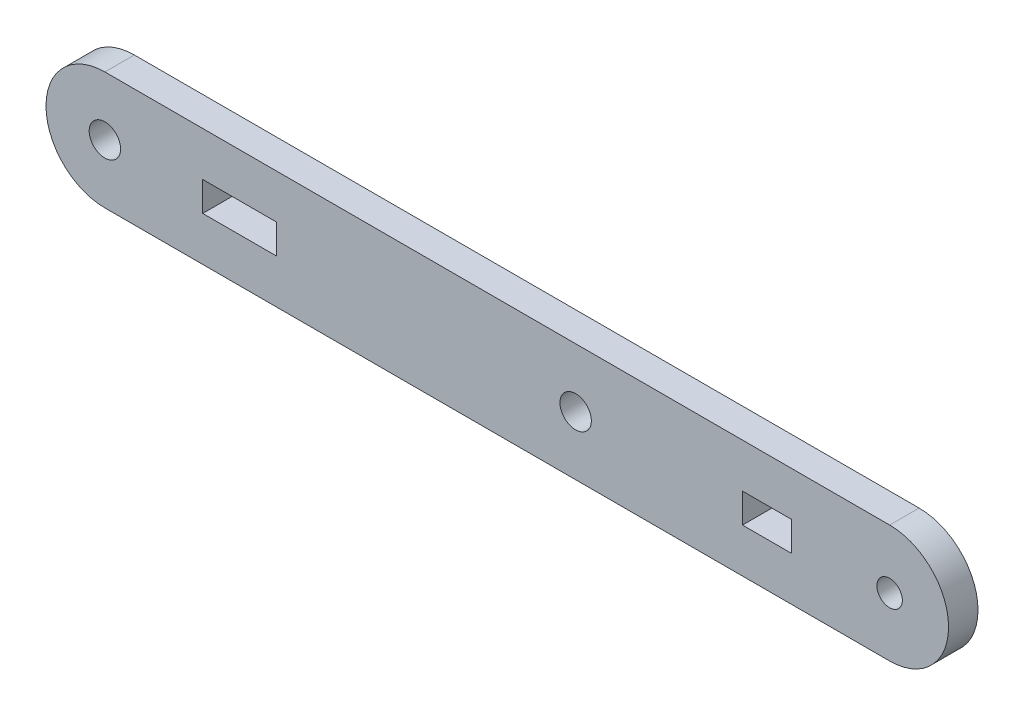
ISO-10303-21;
HEADER;
FILE_DESCRIPTION(('STEP AP214'),'2;1');
FILE_NAME('part.step','',(''),(''),'','','');
FILE_SCHEMA(('AUTOMOTIVE_DESIGN { 1 0 10303 214 1 1 1 1 }'));
ENDSEC;
DATA;
#1=APPLICATION_CONTEXT('core data for automotive mechanical design processes');
#2=APPLICATION_PROTOCOL_DEFINITION('international standard','automotive_design',2000,#1);
#3=PRODUCT_CONTEXT('',#1,'mechanical');
#4=PRODUCT('Part','Part','',(#3));
#5=PRODUCT_RELATED_PRODUCT_CATEGORY('part','',(#4));
#6=PRODUCT_DEFINITION_FORMATION('','',#4);
#7=PRODUCT_DEFINITION_CONTEXT('part definition',#1,'design');
#8=PRODUCT_DEFINITION('design','',#6,#7);
#9=PRODUCT_DEFINITION_SHAPE('','',#8);
#10=(LENGTH_UNIT() NAMED_UNIT(*) SI_UNIT(.MILLI.,.METRE.));
#11=(NAMED_UNIT(*) PLANE_ANGLE_UNIT() SI_UNIT($,.RADIAN.));
#12=(NAMED_UNIT(*) SI_UNIT($,.STERADIAN.) SOLID_ANGLE_UNIT());
#13=UNCERTAINTY_MEASURE_WITH_UNIT(LENGTH_MEASURE(1.E-05),#10,'distance_accuracy_value','');
#14=(GEOMETRIC_REPRESENTATION_CONTEXT(3) GLOBAL_UNCERTAINTY_ASSIGNED_CONTEXT((#13)) GLOBAL_UNIT_ASSIGNED_CONTEXT((#10,
#11,#12)) REPRESENTATION_CONTEXT('',''));
#15=CARTESIAN_POINT('',(0.,0.,0.));
#16=DIRECTION('',(0.,0.,1.));
#17=DIRECTION('',(1.,0.,0.));
#18=AXIS2_PLACEMENT_3D('',#15,#16,#17);
#19=CARTESIAN_POINT('',(30.6181719329405,6.,3.));
#20=DIRECTION('',(0.,0.,-1.));
#21=DIRECTION('',(-1.,0.,0.));
#22=AXIS2_PLACEMENT_3D('',#19,#20,#21);
#23=CYLINDRICAL_SURFACE('',#22,6.);
#24=CARTESIAN_POINT('',(30.6181719329405,6.,0.));
#25=DIRECTION('',(0.,0.,-1.));
#26=DIRECTION('',(-1.,0.,0.));
#27=AXIS2_PLACEMENT_3D('',#24,#25,#26);
#28=CIRCLE('',#27,6.);
#29=CARTESIAN_POINT('',(30.6181719329405,12.,0.));
#30=VERTEX_POINT('',#29);
#31=CARTESIAN_POINT('',(30.6181719329405,0.,0.));
#32=VERTEX_POINT('',#31);
#33=EDGE_CURVE('E216',#30,#32,#28,.T.);
#34=ORIENTED_EDGE('',*,*,#33,.F.);
#35=DIRECTION('',(0.,0.,-1.));
#36=VECTOR('',#35,1.);
#37=CARTESIAN_POINT('',(30.6181719329405,12.,3.));
#38=LINE('',#37,#36);
#39=CARTESIAN_POINT('',(30.6181719329405,12.,3.));
#40=VERTEX_POINT('',#39);
#41=EDGE_CURVE('E11',#40,#30,#38,.T.);
#42=ORIENTED_EDGE('',*,*,#41,.F.);
#43=CARTESIAN_POINT('',(30.6181719329405,6.,3.));
#44=DIRECTION('',(0.,0.,-1.));
#45=DIRECTION('',(-1.,0.,0.));
#46=AXIS2_PLACEMENT_3D('',#43,#44,#45);
#47=CIRCLE('',#46,6.);
#48=CARTESIAN_POINT('',(30.6181719329405,0.,3.));
#49=VERTEX_POINT('',#48);
#50=EDGE_CURVE('E226',#40,#49,#47,.T.);
#51=ORIENTED_EDGE('',*,*,#50,.T.);
#52=DIRECTION('',(0.,0.,-1.));
#53=VECTOR('',#52,1.);
#54=CARTESIAN_POINT('',(30.6181719329405,0.,3.));
#55=LINE('',#54,#53);
#56=EDGE_CURVE('E42',#49,#32,#55,.T.);
#57=ORIENTED_EDGE('',*,*,#56,.T.);
#58=EDGE_LOOP('',(#34,#42,#51,#57));
#59=FACE_BOUND('',#58,.T.);
#60=ADVANCED_FACE('F39',(#59),#23,.T.);
#61=CARTESIAN_POINT('',(-49.3435107871291,12.,3.));
#62=DIRECTION('',(0.,1.,0.));
#63=DIRECTION('',(0.,0.,1.));
#64=AXIS2_PLACEMENT_3D('',#61,#62,#63);
#65=PLANE('',#64);
#66=DIRECTION('',(1.,0.,0.));
#67=VECTOR('',#66,1.);
#68=CARTESIAN_POINT('',(-49.3435107871291,12.,0.));
#69=LINE('',#68,#67);
#70=CARTESIAN_POINT('',(-49.3435107871291,12.,0.));
#71=VERTEX_POINT('',#70);
#72=EDGE_CURVE('E231',#71,#30,#69,.T.);
#73=ORIENTED_EDGE('',*,*,#72,.F.);
#74=DIRECTION('',(0.,0.,-1.));
#75=VECTOR('',#74,1.);
#76=CARTESIAN_POINT('',(-49.3435107871291,12.,3.));
#77=LINE('',#76,#75);
#78=CARTESIAN_POINT('',(-49.3435107871291,12.,3.));
#79=VERTEX_POINT('',#78);
#80=EDGE_CURVE('E48',#79,#71,#77,.T.);
#81=ORIENTED_EDGE('',*,*,#80,.F.);
#82=DIRECTION('',(1.,0.,0.));
#83=VECTOR('',#82,1.);
#84=CARTESIAN_POINT('',(-49.3435107871291,12.,3.));
#85=LINE('',#84,#83);
#86=EDGE_CURVE('E239',#79,#40,#85,.T.);
#87=ORIENTED_EDGE('',*,*,#86,.T.);
#88=ORIENTED_EDGE('',*,*,#41,.T.);
#89=EDGE_LOOP('',(#73,#81,#87,#88));
#90=FACE_BOUND('',#89,.T.);
#91=ADVANCED_FACE('F273',(#90),#65,.T.);
#92=CARTESIAN_POINT('',(-49.3435107871291,6.,3.));
#93=DIRECTION('',(0.,0.,-1.));
#94=DIRECTION('',(-1.,0.,0.));
#95=AXIS2_PLACEMENT_3D('',#92,#93,#94);
#96=CYLINDRICAL_SURFACE('',#95,6.);
#97=CARTESIAN_POINT('',(-49.3435107871291,6.,0.));
#98=DIRECTION('',(0.,0.,-1.));
#99=DIRECTION('',(-1.,0.,0.));
#100=AXIS2_PLACEMENT_3D('',#97,#98,#99);
#101=CIRCLE('',#100,6.);
#102=CARTESIAN_POINT('',(-49.3435107871291,0.,0.));
#103=VERTEX_POINT('',#102);
#104=EDGE_CURVE('E250',#103,#71,#101,.T.);
#105=ORIENTED_EDGE('',*,*,#104,.F.);
#106=DIRECTION('',(0.,0.,-1.));
#107=VECTOR('',#106,1.);
#108=CARTESIAN_POINT('',(-49.3435107871291,0.,3.));
#109=LINE('',#108,#107);
#110=CARTESIAN_POINT('',(-49.3435107871291,0.,3.));
#111=VERTEX_POINT('',#110);
#112=EDGE_CURVE('E258',#111,#103,#109,.T.);
#113=ORIENTED_EDGE('',*,*,#112,.F.);
#114=CARTESIAN_POINT('',(-49.3435107871291,6.,3.));
#115=DIRECTION('',(0.,0.,-1.));
#116=DIRECTION('',(-1.,0.,0.));
#117=AXIS2_PLACEMENT_3D('',#114,#115,#116);
#118=CIRCLE('',#117,6.);
#119=EDGE_CURVE('E235',#111,#79,#118,.T.);
#120=ORIENTED_EDGE('',*,*,#119,.T.);
#121=ORIENTED_EDGE('',*,*,#80,.T.);
#122=EDGE_LOOP('',(#105,#113,#120,#121));
#123=FACE_BOUND('',#122,.T.);
#124=ADVANCED_FACE('F278',(#123),#96,.T.);
#125=CARTESIAN_POINT('',(30.6181719329405,0.,3.));
#126=DIRECTION('',(0.,-1.,0.));
#127=DIRECTION('',(0.,0.,-1.));
#128=AXIS2_PLACEMENT_3D('',#125,#126,#127);
#129=PLANE('',#128);
#130=DIRECTION('',(-1.,0.,0.));
#131=VECTOR('',#130,1.);
#132=CARTESIAN_POINT('',(30.6181719329405,0.,0.));
#133=LINE('',#132,#131);
#134=EDGE_CURVE('E246',#32,#103,#133,.T.);
#135=ORIENTED_EDGE('',*,*,#134,.F.);
#136=ORIENTED_EDGE('',*,*,#56,.F.);
#137=DIRECTION('',(-1.,0.,0.));
#138=VECTOR('',#137,1.);
#139=CARTESIAN_POINT('',(30.6181719329405,0.,3.));
#140=LINE('',#139,#138);
#141=EDGE_CURVE('E230',#49,#111,#140,.T.);
#142=ORIENTED_EDGE('',*,*,#141,.T.);
#143=ORIENTED_EDGE('',*,*,#112,.T.);
#144=EDGE_LOOP('',(#135,#136,#142,#143));
#145=FACE_BOUND('',#144,.T.);
#146=ADVANCED_FACE('F268',(#145),#129,.T.);
#147=CARTESIAN_POINT('',(30.6181719329405,6.,3.));
#148=DIRECTION('',(0.,0.,-1.));
#149=DIRECTION('',(-1.,0.,0.));
#150=AXIS2_PLACEMENT_3D('',#147,#148,#149);
#151=PLANE('',#150);
#152=CARTESIAN_POINT('',(-49.3435107871291,6.,3.));
#153=DIRECTION('',(0.,0.,1.));
#154=DIRECTION('',(1.,0.,0.));
#155=AXIS2_PLACEMENT_3D('',#152,#153,#154);
#156=CIRCLE('',#155,1.6);
#157=CARTESIAN_POINT('',(-47.7435107871291,6.,3.));
#158=VERTEX_POINT('',#157);
#159=EDGE_CURVE('E436',#158,#158,#156,.T.);
#160=ORIENTED_EDGE('',*,*,#159,.F.);
#161=EDGE_LOOP('',(#160));
#162=FACE_BOUND('',#161,.T.);
#163=CARTESIAN_POINT('',(-1.37928682812217,6.00015,3.));
#164=DIRECTION('',(0.,0.,1.));
#165=DIRECTION('',(1.,0.,0.));
#166=AXIS2_PLACEMENT_3D('',#163,#164,#165);
#167=CIRCLE('',#166,1.6);
#168=CARTESIAN_POINT('',(0.22071317187783,6.00015,3.));
#169=VERTEX_POINT('',#168);
#170=EDGE_CURVE('E444',#169,#169,#167,.T.);
#171=ORIENTED_EDGE('',*,*,#170,.F.);
#172=EDGE_LOOP('',(#171));
#173=FACE_BOUND('',#172,.T.);
#174=CARTESIAN_POINT('',(30.6116066975977,6.0001,3.));
#175=DIRECTION('',(0.,0.,-1.));
#176=DIRECTION('',(1.,0.,0.));
#177=AXIS2_PLACEMENT_3D('',#174,#175,#176);
#178=CIRCLE('',#177,1.3);
#179=CARTESIAN_POINT('',(31.9116066975977,6.0001,3.));
#180=VERTEX_POINT('',#179);
#181=EDGE_CURVE('E167',#180,#180,#178,.T.);
#182=ORIENTED_EDGE('',*,*,#181,.T.);
#183=EDGE_LOOP('',(#182));
#184=FACE_BOUND('',#183,.T.);
#185=DIRECTION('',(0.,1.,0.));
#186=VECTOR('',#185,1.);
#187=CARTESIAN_POINT('',(15.6218066975976,7.4995,3.));
#188=LINE('',#187,#186);
#189=CARTESIAN_POINT('',(15.6218066975976,4.4994,3.));
#190=VERTEX_POINT('',#189);
#191=CARTESIAN_POINT('',(15.6218066975976,7.4995,3.));
#192=VERTEX_POINT('',#191);
#193=EDGE_CURVE('E138',#190,#192,#188,.T.);
#194=ORIENTED_EDGE('',*,*,#193,.T.);
#195=DIRECTION('',(1.,0.,0.));
#196=VECTOR('',#195,1.);
#197=CARTESIAN_POINT('',(20.6213066975977,7.4995,3.));
#198=LINE('',#197,#196);
#199=CARTESIAN_POINT('',(20.6213066975977,7.4995,3.));
#200=VERTEX_POINT('',#199);
#201=EDGE_CURVE('E131',#192,#200,#198,.T.);
#202=ORIENTED_EDGE('',*,*,#201,.T.);
#203=DIRECTION('',(0.,-1.,0.));
#204=VECTOR('',#203,1.);
#205=CARTESIAN_POINT('',(20.6213066975977,4.4994,3.));
#206=LINE('',#205,#204);
#207=CARTESIAN_POINT('',(20.6213066975977,4.4994,3.));
#208=VERTEX_POINT('',#207);
#209=EDGE_CURVE('E141',#200,#208,#206,.T.);
#210=ORIENTED_EDGE('',*,*,#209,.T.);
#211=DIRECTION('',(-1.,0.,0.));
#212=VECTOR('',#211,1.);
#213=CARTESIAN_POINT('',(15.6218066975976,4.4994,3.));
#214=LINE('',#213,#212);
#215=EDGE_CURVE('E56',#208,#190,#214,.T.);
#216=ORIENTED_EDGE('',*,*,#215,.T.);
#217=EDGE_LOOP('',(#194,#202,#210,#216));
#218=FACE_BOUND('',#217,.T.);
#219=DIRECTION('',(-1.,0.,0.));
#220=VECTOR('',#219,1.);
#221=CARTESIAN_POINT('',(-39.3782933024023,4.4994,3.));
#222=LINE('',#221,#220);
#223=CARTESIAN_POINT('',(-31.8790933024024,4.4994,3.));
#224=VERTEX_POINT('',#223);
#225=CARTESIAN_POINT('',(-39.3782933024023,4.4994,3.));
#226=VERTEX_POINT('',#225);
#227=EDGE_CURVE('E195',#224,#226,#222,.T.);
#228=ORIENTED_EDGE('',*,*,#227,.T.);
#229=DIRECTION('',(0.,1.,0.));
#230=VECTOR('',#229,1.);
#231=CARTESIAN_POINT('',(-39.3782933024023,7.4995,3.));
#232=LINE('',#231,#230);
#233=CARTESIAN_POINT('',(-39.3782933024023,7.4995,3.));
#234=VERTEX_POINT('',#233);
#235=EDGE_CURVE('E182',#226,#234,#232,.T.);
#236=ORIENTED_EDGE('',*,*,#235,.T.);
#237=DIRECTION('',(1.,0.,0.));
#238=VECTOR('',#237,1.);
#239=CARTESIAN_POINT('',(-31.8790933024024,7.4995,3.));
#240=LINE('',#239,#238);
#241=CARTESIAN_POINT('',(-31.8790933024024,7.4995,3.));
#242=VERTEX_POINT('',#241);
#243=EDGE_CURVE('E186',#234,#242,#240,.T.);
#244=ORIENTED_EDGE('',*,*,#243,.T.);
#245=DIRECTION('',(0.,-1.,0.));
#246=VECTOR('',#245,1.);
#247=CARTESIAN_POINT('',(-31.8790933024024,4.4994,3.));
#248=LINE('',#247,#246);
#249=EDGE_CURVE('E191',#242,#224,#248,.T.);
#250=ORIENTED_EDGE('',*,*,#249,.T.);
#251=EDGE_LOOP('',(#228,#236,#244,#250));
#252=FACE_BOUND('',#251,.T.);
#253=ORIENTED_EDGE('',*,*,#50,.F.);
#254=ORIENTED_EDGE('',*,*,#86,.F.);
#255=ORIENTED_EDGE('',*,*,#119,.F.);
#256=ORIENTED_EDGE('',*,*,#141,.F.);
#257=EDGE_LOOP('',(#253,#254,#255,#256));
#258=FACE_BOUND('',#257,.T.);
#259=ADVANCED_FACE('F146',(#162,#173,#184,#218,#252,#258),#151,.F.);
#260=CARTESIAN_POINT('',(30.6181719329405,6.,0.));
#261=DIRECTION('',(0.,0.,-1.));
#262=DIRECTION('',(-1.,0.,0.));
#263=AXIS2_PLACEMENT_3D('',#260,#261,#262);
#264=PLANE('',#263);
#265=CARTESIAN_POINT('',(-49.3435107871291,6.,0.));
#266=DIRECTION('',(0.,0.,1.));
#267=DIRECTION('',(1.,0.,0.));
#268=AXIS2_PLACEMENT_3D('',#265,#266,#267);
#269=CIRCLE('',#268,1.6);
#270=CARTESIAN_POINT('',(-47.7435107871291,6.,0.));
#271=VERTEX_POINT('',#270);
#272=EDGE_CURVE('E433',#271,#271,#269,.T.);
#273=ORIENTED_EDGE('',*,*,#272,.T.);
#274=EDGE_LOOP('',(#273));
#275=FACE_BOUND('',#274,.T.);
#276=CARTESIAN_POINT('',(-1.37928682812217,6.00015,0.));
#277=DIRECTION('',(0.,0.,1.));
#278=DIRECTION('',(1.,0.,0.));
#279=AXIS2_PLACEMENT_3D('',#276,#277,#278);
#280=CIRCLE('',#279,1.6);
#281=CARTESIAN_POINT('',(0.22071317187783,6.00015,0.));
#282=VERTEX_POINT('',#281);
#283=EDGE_CURVE('E438',#282,#282,#280,.T.);
#284=ORIENTED_EDGE('',*,*,#283,.T.);
#285=EDGE_LOOP('',(#284));
#286=FACE_BOUND('',#285,.T.);
#287=CARTESIAN_POINT('',(30.6116066975977,6.0001,0.));
#288=DIRECTION('',(0.,0.,-1.));
#289=DIRECTION('',(1.,0.,0.));
#290=AXIS2_PLACEMENT_3D('',#287,#288,#289);
#291=CIRCLE('',#290,1.3);
#292=CARTESIAN_POINT('',(31.9116066975977,6.0001,0.));
#293=VERTEX_POINT('',#292);
#294=EDGE_CURVE('E157',#293,#293,#291,.T.);
#295=ORIENTED_EDGE('',*,*,#294,.F.);
#296=EDGE_LOOP('',(#295));
#297=FACE_BOUND('',#296,.T.);
#298=DIRECTION('',(1.,0.,0.));
#299=VECTOR('',#298,1.);
#300=CARTESIAN_POINT('',(20.6213066975977,7.4995,0.));
#301=LINE('',#300,#299);
#302=CARTESIAN_POINT('',(15.6218066975976,7.4995,0.));
#303=VERTEX_POINT('',#302);
#304=CARTESIAN_POINT('',(20.6213066975977,7.4995,0.));
#305=VERTEX_POINT('',#304);
#306=EDGE_CURVE('E64',#303,#305,#301,.T.);
#307=ORIENTED_EDGE('',*,*,#306,.F.);
#308=DIRECTION('',(0.,1.,0.));
#309=VECTOR('',#308,1.);
#310=CARTESIAN_POINT('',(15.6218066975976,7.4995,0.));
#311=LINE('',#310,#309);
#312=CARTESIAN_POINT('',(15.6218066975976,4.4994,0.));
#313=VERTEX_POINT('',#312);
#314=EDGE_CURVE('E150',#313,#303,#311,.T.);
#315=ORIENTED_EDGE('',*,*,#314,.F.);
#316=DIRECTION('',(-1.,0.,0.));
#317=VECTOR('',#316,1.);
#318=CARTESIAN_POINT('',(15.6218066975976,4.4994,0.));
#319=LINE('',#318,#317);
#320=CARTESIAN_POINT('',(20.6213066975977,4.4994,0.));
#321=VERTEX_POINT('',#320);
#322=EDGE_CURVE('E154',#321,#313,#319,.T.);
#323=ORIENTED_EDGE('',*,*,#322,.F.);
#324=DIRECTION('',(0.,-1.,0.));
#325=VECTOR('',#324,1.);
#326=CARTESIAN_POINT('',(20.6213066975977,4.4994,0.));
#327=LINE('',#326,#325);
#328=EDGE_CURVE('E166',#305,#321,#327,.T.);
#329=ORIENTED_EDGE('',*,*,#328,.F.);
#330=EDGE_LOOP('',(#307,#315,#323,#329));
#331=FACE_BOUND('',#330,.T.);
#332=DIRECTION('',(0.,1.,0.));
#333=VECTOR('',#332,1.);
#334=CARTESIAN_POINT('',(-39.3782933024023,7.4995,0.));
#335=LINE('',#334,#333);
#336=CARTESIAN_POINT('',(-39.3782933024023,4.4994,0.));
#337=VERTEX_POINT('',#336);
#338=CARTESIAN_POINT('',(-39.3782933024023,7.4995,0.));
#339=VERTEX_POINT('',#338);
#340=EDGE_CURVE('E176',#337,#339,#335,.T.);
#341=ORIENTED_EDGE('',*,*,#340,.F.);
#342=DIRECTION('',(-1.,0.,0.));
#343=VECTOR('',#342,1.);
#344=CARTESIAN_POINT('',(-39.3782933024023,4.4994,0.));
#345=LINE('',#344,#343);
#346=CARTESIAN_POINT('',(-31.8790933024024,4.4994,0.));
#347=VERTEX_POINT('',#346);
#348=EDGE_CURVE('E187',#347,#337,#345,.T.);
#349=ORIENTED_EDGE('',*,*,#348,.F.);
#350=DIRECTION('',(0.,-1.,0.));
#351=VECTOR('',#350,1.);
#352=CARTESIAN_POINT('',(-31.8790933024024,4.4994,0.));
#353=LINE('',#352,#351);
#354=CARTESIAN_POINT('',(-31.8790933024024,7.4995,0.));
#355=VERTEX_POINT('',#354);
#356=EDGE_CURVE('E206',#355,#347,#353,.T.);
#357=ORIENTED_EDGE('',*,*,#356,.F.);
#358=DIRECTION('',(1.,0.,0.));
#359=VECTOR('',#358,1.);
#360=CARTESIAN_POINT('',(-31.8790933024024,7.4995,0.));
#361=LINE('',#360,#359);
#362=EDGE_CURVE('E202',#339,#355,#361,.T.);
#363=ORIENTED_EDGE('',*,*,#362,.F.);
#364=EDGE_LOOP('',(#341,#349,#357,#363));
#365=FACE_BOUND('',#364,.T.);
#366=ORIENTED_EDGE('',*,*,#33,.T.);
#367=ORIENTED_EDGE('',*,*,#134,.T.);
#368=ORIENTED_EDGE('',*,*,#104,.T.);
#369=ORIENTED_EDGE('',*,*,#72,.T.);
#370=EDGE_LOOP('',(#366,#367,#368,#369));
#371=FACE_BOUND('',#370,.T.);
#372=ADVANCED_FACE('F270',(#275,#286,#297,#331,#365,#371),#264,.T.);
#373=CARTESIAN_POINT('',(-39.3782933024023,7.4995,3.));
#374=DIRECTION('',(-1.,0.,0.));
#375=DIRECTION('',(0.,0.,1.));
#376=AXIS2_PLACEMENT_3D('',#373,#374,#375);
#377=PLANE('',#376);
#378=ORIENTED_EDGE('',*,*,#340,.T.);
#379=DIRECTION('',(0.,0.,-1.));
#380=VECTOR('',#379,1.);
#381=CARTESIAN_POINT('',(-39.3782933024023,7.4995,3.));
#382=LINE('',#381,#380);
#383=EDGE_CURVE('E199',#234,#339,#382,.T.);
#384=ORIENTED_EDGE('',*,*,#383,.F.);
#385=ORIENTED_EDGE('',*,*,#235,.F.);
#386=DIRECTION('',(0.,0.,-1.));
#387=VECTOR('',#386,1.);
#388=CARTESIAN_POINT('',(-39.3782933024023,4.4994,3.));
#389=LINE('',#388,#387);
#390=EDGE_CURVE('E213',#226,#337,#389,.T.);
#391=ORIENTED_EDGE('',*,*,#390,.T.);
#392=EDGE_LOOP('',(#378,#384,#385,#391));
#393=FACE_BOUND('',#392,.T.);
#394=ADVANCED_FACE('F310',(#393),#377,.F.);
#395=CARTESIAN_POINT('',(-39.3782933024023,4.4994,3.));
#396=DIRECTION('',(0.,-1.,0.));
#397=DIRECTION('',(0.,0.,-1.));
#398=AXIS2_PLACEMENT_3D('',#395,#396,#397);
#399=PLANE('',#398);
#400=ORIENTED_EDGE('',*,*,#348,.T.);
#401=ORIENTED_EDGE('',*,*,#390,.F.);
#402=ORIENTED_EDGE('',*,*,#227,.F.);
#403=DIRECTION('',(0.,0.,-1.));
#404=VECTOR('',#403,1.);
#405=CARTESIAN_POINT('',(-31.8790933024024,4.4994,3.));
#406=LINE('',#405,#404);
#407=EDGE_CURVE('E217',#224,#347,#406,.T.);
#408=ORIENTED_EDGE('',*,*,#407,.T.);
#409=EDGE_LOOP('',(#400,#401,#402,#408));
#410=FACE_BOUND('',#409,.T.);
#411=ADVANCED_FACE('F315',(#410),#399,.F.);
#412=CARTESIAN_POINT('',(-31.8790933024024,4.4994,3.));
#413=DIRECTION('',(1.,0.,0.));
#414=DIRECTION('',(0.,0.,-1.));
#415=AXIS2_PLACEMENT_3D('',#412,#413,#414);
#416=PLANE('',#415);
#417=ORIENTED_EDGE('',*,*,#356,.T.);
#418=ORIENTED_EDGE('',*,*,#407,.F.);
#419=ORIENTED_EDGE('',*,*,#249,.F.);
#420=DIRECTION('',(0.,0.,-1.));
#421=VECTOR('',#420,1.);
#422=CARTESIAN_POINT('',(-31.8790933024024,7.4995,3.));
#423=LINE('',#422,#421);
#424=EDGE_CURVE('E220',#242,#355,#423,.T.);
#425=ORIENTED_EDGE('',*,*,#424,.T.);
#426=EDGE_LOOP('',(#417,#418,#419,#425));
#427=FACE_BOUND('',#426,.T.);
#428=ADVANCED_FACE('F327',(#427),#416,.F.);
#429=CARTESIAN_POINT('',(-31.8790933024024,7.4995,3.));
#430=DIRECTION('',(0.,1.,0.));
#431=DIRECTION('',(0.,0.,1.));
#432=AXIS2_PLACEMENT_3D('',#429,#430,#431);
#433=PLANE('',#432);
#434=ORIENTED_EDGE('',*,*,#362,.T.);
#435=ORIENTED_EDGE('',*,*,#424,.F.);
#436=ORIENTED_EDGE('',*,*,#243,.F.);
#437=ORIENTED_EDGE('',*,*,#383,.T.);
#438=EDGE_LOOP('',(#434,#435,#436,#437));
#439=FACE_BOUND('',#438,.T.);
#440=ADVANCED_FACE('F337',(#439),#433,.F.);
#441=CARTESIAN_POINT('',(20.6213066975977,7.4995,3.));
#442=DIRECTION('',(0.,1.,0.));
#443=DIRECTION('',(0.,0.,1.));
#444=AXIS2_PLACEMENT_3D('',#441,#442,#443);
#445=PLANE('',#444);
#446=ORIENTED_EDGE('',*,*,#306,.T.);
#447=DIRECTION('',(0.,0.,-1.));
#448=VECTOR('',#447,1.);
#449=CARTESIAN_POINT('',(20.6213066975977,7.4995,3.));
#450=LINE('',#449,#448);
#451=EDGE_CURVE('E127',#200,#305,#450,.T.);
#452=ORIENTED_EDGE('',*,*,#451,.F.);
#453=ORIENTED_EDGE('',*,*,#201,.F.);
#454=DIRECTION('',(0.,0.,-1.));
#455=VECTOR('',#454,1.);
#456=CARTESIAN_POINT('',(15.6218066975976,7.4995,3.));
#457=LINE('',#456,#455);
#458=EDGE_CURVE('E173',#192,#303,#457,.T.);
#459=ORIENTED_EDGE('',*,*,#458,.T.);
#460=EDGE_LOOP('',(#446,#452,#453,#459));
#461=FACE_BOUND('',#460,.T.);
#462=ADVANCED_FACE('F129',(#461),#445,.F.);
#463=CARTESIAN_POINT('',(15.6218066975976,7.4995,3.));
#464=DIRECTION('',(-1.,0.,0.));
#465=DIRECTION('',(0.,0.,1.));
#466=AXIS2_PLACEMENT_3D('',#463,#464,#465);
#467=PLANE('',#466);
#468=ORIENTED_EDGE('',*,*,#314,.T.);
#469=ORIENTED_EDGE('',*,*,#458,.F.);
#470=ORIENTED_EDGE('',*,*,#193,.F.);
#471=DIRECTION('',(0.,0.,-1.));
#472=VECTOR('',#471,1.);
#473=CARTESIAN_POINT('',(15.6218066975976,4.4994,3.));
#474=LINE('',#473,#472);
#475=EDGE_CURVE('E177',#190,#313,#474,.T.);
#476=ORIENTED_EDGE('',*,*,#475,.T.);
#477=EDGE_LOOP('',(#468,#469,#470,#476));
#478=FACE_BOUND('',#477,.T.);
#479=ADVANCED_FACE('F356',(#478),#467,.F.);
#480=CARTESIAN_POINT('',(15.6218066975976,4.4994,3.));
#481=DIRECTION('',(0.,-1.,0.));
#482=DIRECTION('',(0.,0.,-1.));
#483=AXIS2_PLACEMENT_3D('',#480,#481,#482);
#484=PLANE('',#483);
#485=ORIENTED_EDGE('',*,*,#322,.T.);
#486=ORIENTED_EDGE('',*,*,#475,.F.);
#487=ORIENTED_EDGE('',*,*,#215,.F.);
#488=DIRECTION('',(0.,0.,-1.));
#489=VECTOR('',#488,1.);
#490=CARTESIAN_POINT('',(20.6213066975977,4.4994,3.));
#491=LINE('',#490,#489);
#492=EDGE_CURVE('E137',#208,#321,#491,.T.);
#493=ORIENTED_EDGE('',*,*,#492,.T.);
#494=EDGE_LOOP('',(#485,#486,#487,#493));
#495=FACE_BOUND('',#494,.T.);
#496=ADVANCED_FACE('F365',(#495),#484,.F.);
#497=CARTESIAN_POINT('',(20.6213066975977,4.4994,3.));
#498=DIRECTION('',(1.,0.,0.));
#499=DIRECTION('',(0.,1.,0.));
#500=AXIS2_PLACEMENT_3D('',#497,#498,#499);
#501=PLANE('',#500);
#502=ORIENTED_EDGE('',*,*,#328,.T.);
#503=ORIENTED_EDGE('',*,*,#492,.F.);
#504=ORIENTED_EDGE('',*,*,#209,.F.);
#505=ORIENTED_EDGE('',*,*,#451,.T.);
#506=EDGE_LOOP('',(#502,#503,#504,#505));
#507=FACE_BOUND('',#506,.T.);
#508=ADVANCED_FACE('F142',(#507),#501,.F.);
#509=CARTESIAN_POINT('',(30.6116066975977,6.0001,3.));
#510=DIRECTION('',(0.,0.,-1.));
#511=DIRECTION('',(-1.,0.,0.));
#512=AXIS2_PLACEMENT_3D('',#509,#510,#511);
#513=CYLINDRICAL_SURFACE('',#512,1.3);
#514=ORIENTED_EDGE('',*,*,#181,.F.);
#515=EDGE_LOOP('',(#514));
#516=FACE_BOUND('',#515,.T.);
#517=ORIENTED_EDGE('',*,*,#294,.T.);
#518=EDGE_LOOP('',(#517));
#519=FACE_BOUND('',#518,.T.);
#520=ADVANCED_FACE('F383',(#516,#519),#513,.F.);
#521=CARTESIAN_POINT('',(-1.37928682812217,6.00015,0.));
#522=DIRECTION('',(0.,0.,1.));
#523=DIRECTION('',(1.,0.,0.));
#524=AXIS2_PLACEMENT_3D('',#521,#522,#523);
#525=CYLINDRICAL_SURFACE('',#524,1.6);
#526=ORIENTED_EDGE('',*,*,#283,.F.);
#527=EDGE_LOOP('',(#526));
#528=FACE_BOUND('',#527,.T.);
#529=ORIENTED_EDGE('',*,*,#170,.T.);
#530=EDGE_LOOP('',(#529));
#531=FACE_BOUND('',#530,.T.);
#532=ADVANCED_FACE('F392',(#528,#531),#525,.F.);
#533=CARTESIAN_POINT('',(-49.3435107871291,6.,0.));
#534=DIRECTION('',(0.,0.,1.));
#535=DIRECTION('',(1.,0.,0.));
#536=AXIS2_PLACEMENT_3D('',#533,#534,#535);
#537=CYLINDRICAL_SURFACE('',#536,1.6);
#538=ORIENTED_EDGE('',*,*,#272,.F.);
#539=EDGE_LOOP('',(#538));
#540=FACE_BOUND('',#539,.T.);
#541=ORIENTED_EDGE('',*,*,#159,.T.);
#542=EDGE_LOOP('',(#541));
#543=FACE_BOUND('',#542,.T.);
#544=ADVANCED_FACE('F416',(#540,#543),#537,.F.);
#545=CLOSED_SHELL('',(#60,#91,#124,#146,#259,#372,#394,#411,#428,#440,#462,#479,#496,#508,#520,
#532,#544));
#546=MANIFOLD_SOLID_BREP('B2',#545);
#547=ADVANCED_BREP_SHAPE_REPRESENTATION('',(#18,#546),#14);
#548=SHAPE_DEFINITION_REPRESENTATION(#9,#547);
ENDSEC;
END-ISO-10303-21;
